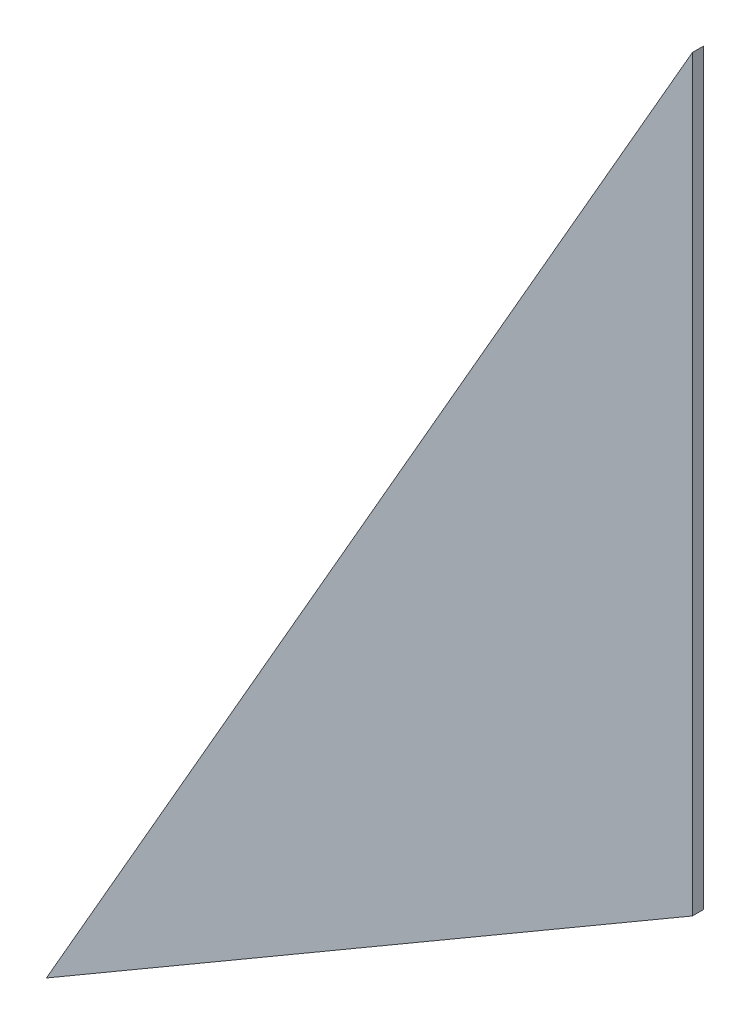
ISO-10303-21;
HEADER;
FILE_DESCRIPTION(('STEP AP214'),'2;1');
FILE_NAME('part.step','',(''),(''),'','','');
FILE_SCHEMA(('AUTOMOTIVE_DESIGN { 1 0 10303 214 1 1 1 1 }'));
ENDSEC;
DATA;
#1=APPLICATION_CONTEXT('core data for automotive mechanical design processes');
#2=APPLICATION_PROTOCOL_DEFINITION('international standard','automotive_design',2000,#1);
#3=PRODUCT_CONTEXT('',#1,'mechanical');
#4=PRODUCT('Part','Part','',(#3));
#5=PRODUCT_RELATED_PRODUCT_CATEGORY('part','',(#4));
#6=PRODUCT_DEFINITION_FORMATION('','',#4);
#7=PRODUCT_DEFINITION_CONTEXT('part definition',#1,'design');
#8=PRODUCT_DEFINITION('design','',#6,#7);
#9=PRODUCT_DEFINITION_SHAPE('','',#8);
#10=(LENGTH_UNIT() NAMED_UNIT(*) SI_UNIT(.MILLI.,.METRE.));
#11=(NAMED_UNIT(*) PLANE_ANGLE_UNIT() SI_UNIT($,.RADIAN.));
#12=(NAMED_UNIT(*) SI_UNIT($,.STERADIAN.) SOLID_ANGLE_UNIT());
#13=UNCERTAINTY_MEASURE_WITH_UNIT(LENGTH_MEASURE(1.E-05),#10,'distance_accuracy_value','');
#14=(GEOMETRIC_REPRESENTATION_CONTEXT(3) GLOBAL_UNCERTAINTY_ASSIGNED_CONTEXT((#13)) GLOBAL_UNIT_ASSIGNED_CONTEXT((#10,
#11,#12)) REPRESENTATION_CONTEXT('',''));
#15=CARTESIAN_POINT('',(0.,0.,0.));
#16=DIRECTION('',(0.,0.,1.));
#17=DIRECTION('',(1.,0.,0.));
#18=AXIS2_PLACEMENT_3D('',#15,#16,#17);
#19=CARTESIAN_POINT('',(0.301812041205604,-2.162479810064,0.));
#20=DIRECTION('',(-0.867108701202205,0.498118961995451,0.));
#21=DIRECTION('',(-0.498118961995451,-0.867108701202205,0.));
#22=AXIS2_PLACEMENT_3D('',#19,#20,#21);
#23=PLANE('',#22);
#24=DIRECTION('',(-0.498118961995451,-0.867108701202205,0.));
#25=VECTOR('',#24,1.);
#26=CARTESIAN_POINT('',(0.301812041205604,-2.162479810064,0.));
#27=LINE('',#26,#25);
#28=CARTESIAN_POINT('',(0.301812041205604,-2.162479810064,0.));
#29=VERTEX_POINT('',#28);
#30=CARTESIAN_POINT('',(0.129085333072963,-2.463156642265,0.));
#31=VERTEX_POINT('',#30);
#32=EDGE_CURVE('E11',#29,#31,#27,.T.);
#33=ORIENTED_EDGE('',*,*,#32,.T.);
#34=DIRECTION('',(0.,0.,1.));
#35=VECTOR('',#34,1.);
#36=CARTESIAN_POINT('',(0.129085333072963,-2.463156642265,0.));
#37=LINE('',#36,#35);
#38=CARTESIAN_POINT('',(0.129085333072963,-2.463156642265,0.003));
#39=VERTEX_POINT('',#38);
#40=EDGE_CURVE('E24',#31,#39,#37,.T.);
#41=ORIENTED_EDGE('',*,*,#40,.T.);
#42=DIRECTION('',(-0.498118961995451,-0.867108701202205,0.));
#43=VECTOR('',#42,1.);
#44=CARTESIAN_POINT('',(0.301812041205604,-2.162479810064,0.003));
#45=LINE('',#44,#43);
#46=CARTESIAN_POINT('',(0.301812041205604,-2.162479810064,0.003));
#47=VERTEX_POINT('',#46);
#48=EDGE_CURVE('E67',#47,#39,#45,.T.);
#49=ORIENTED_EDGE('',*,*,#48,.F.);
#50=DIRECTION('',(0.,0.,1.));
#51=VECTOR('',#50,1.);
#52=CARTESIAN_POINT('',(0.301812041205604,-2.162479810064,0.));
#53=LINE('',#52,#51);
#54=EDGE_CURVE('E54',#29,#47,#53,.T.);
#55=ORIENTED_EDGE('',*,*,#54,.F.);
#56=EDGE_LOOP('',(#33,#41,#49,#55));
#57=FACE_BOUND('',#56,.T.);
#58=ADVANCED_FACE('F17',(#57),#23,.T.);
#59=CARTESIAN_POINT('',(0.301812041205604,-2.362430488413,0.));
#60=DIRECTION('',(1.,0.,0.));
#61=DIRECTION('',(0.,1.,0.));
#62=AXIS2_PLACEMENT_3D('',#59,#60,#61);
#63=PLANE('',#62);
#64=DIRECTION('',(0.,1.,0.));
#65=VECTOR('',#64,1.);
#66=CARTESIAN_POINT('',(0.301812041205604,-2.362430488413,0.));
#67=LINE('',#66,#65);
#68=CARTESIAN_POINT('',(0.301812041205604,-2.362430488413,0.));
#69=VERTEX_POINT('',#68);
#70=EDGE_CURVE('E58',#69,#29,#67,.T.);
#71=ORIENTED_EDGE('',*,*,#70,.T.);
#72=ORIENTED_EDGE('',*,*,#54,.T.);
#73=DIRECTION('',(0.,1.,0.));
#74=VECTOR('',#73,1.);
#75=CARTESIAN_POINT('',(0.301812041205604,-2.362430488413,0.003));
#76=LINE('',#75,#74);
#77=CARTESIAN_POINT('',(0.301812041205604,-2.362430488413,0.003));
#78=VERTEX_POINT('',#77);
#79=EDGE_CURVE('E48',#78,#47,#76,.T.);
#80=ORIENTED_EDGE('',*,*,#79,.F.);
#81=DIRECTION('',(0.,0.,1.));
#82=VECTOR('',#81,1.);
#83=CARTESIAN_POINT('',(0.301812041205604,-2.362430488413,0.));
#84=LINE('',#83,#82);
#85=EDGE_CURVE('E52',#69,#78,#84,.T.);
#86=ORIENTED_EDGE('',*,*,#85,.F.);
#87=EDGE_LOOP('',(#71,#72,#80,#86));
#88=FACE_BOUND('',#87,.T.);
#89=ADVANCED_FACE('F51',(#88),#63,.T.);
#90=CARTESIAN_POINT('',(0.129085333072963,-2.463156642265,0.));
#91=DIRECTION('',(0.503754999401126,-0.863846572360145,0.));
#92=DIRECTION('',(0.863846572360145,0.503754999401126,0.));
#93=AXIS2_PLACEMENT_3D('',#90,#91,#92);
#94=PLANE('',#93);
#95=DIRECTION('',(0.863846572360145,0.503754999401126,0.));
#96=VECTOR('',#95,1.);
#97=CARTESIAN_POINT('',(0.129085333072963,-2.463156642265,0.));
#98=LINE('',#97,#96);
#99=EDGE_CURVE('E64',#31,#69,#98,.T.);
#100=ORIENTED_EDGE('',*,*,#99,.T.);
#101=ORIENTED_EDGE('',*,*,#85,.T.);
#102=DIRECTION('',(0.863846572360145,0.503754999401126,0.));
#103=VECTOR('',#102,1.);
#104=CARTESIAN_POINT('',(0.129085333072963,-2.463156642265,0.003));
#105=LINE('',#104,#103);
#106=EDGE_CURVE('E63',#39,#78,#105,.T.);
#107=ORIENTED_EDGE('',*,*,#106,.F.);
#108=ORIENTED_EDGE('',*,*,#40,.F.);
#109=EDGE_LOOP('',(#100,#101,#107,#108));
#110=FACE_BOUND('',#109,.T.);
#111=ADVANCED_FACE('F62',(#110),#94,.T.);
#112=CARTESIAN_POINT('',(0.215448687139284,-2.312818226165,0.003));
#113=DIRECTION('',(0.,0.,1.));
#114=DIRECTION('',(1.,0.,0.));
#115=AXIS2_PLACEMENT_3D('',#112,#113,#114);
#116=PLANE('',#115);
#117=ORIENTED_EDGE('',*,*,#106,.T.);
#118=ORIENTED_EDGE('',*,*,#79,.T.);
#119=ORIENTED_EDGE('',*,*,#48,.T.);
#120=EDGE_LOOP('',(#117,#118,#119));
#121=FACE_BOUND('',#120,.T.);
#122=ADVANCED_FACE('F66',(#121),#116,.T.);
#123=CARTESIAN_POINT('',(0.215448687139284,-2.312818226165,0.));
#124=DIRECTION('',(0.,0.,1.));
#125=DIRECTION('',(1.,0.,0.));
#126=AXIS2_PLACEMENT_3D('',#123,#124,#125);
#127=PLANE('',#126);
#128=ORIENTED_EDGE('',*,*,#99,.F.);
#129=ORIENTED_EDGE('',*,*,#32,.F.);
#130=ORIENTED_EDGE('',*,*,#70,.F.);
#131=EDGE_LOOP('',(#128,#129,#130));
#132=FACE_BOUND('',#131,.T.);
#133=ADVANCED_FACE('F73',(#132),#127,.F.);
#134=CLOSED_SHELL('',(#58,#89,#111,#122,#133));
#135=MANIFOLD_SOLID_BREP('B1',#134);
#136=ADVANCED_BREP_SHAPE_REPRESENTATION('',(#18,#135),#14);
#137=SHAPE_DEFINITION_REPRESENTATION(#9,#136);
ENDSEC;
END-ISO-10303-21;
